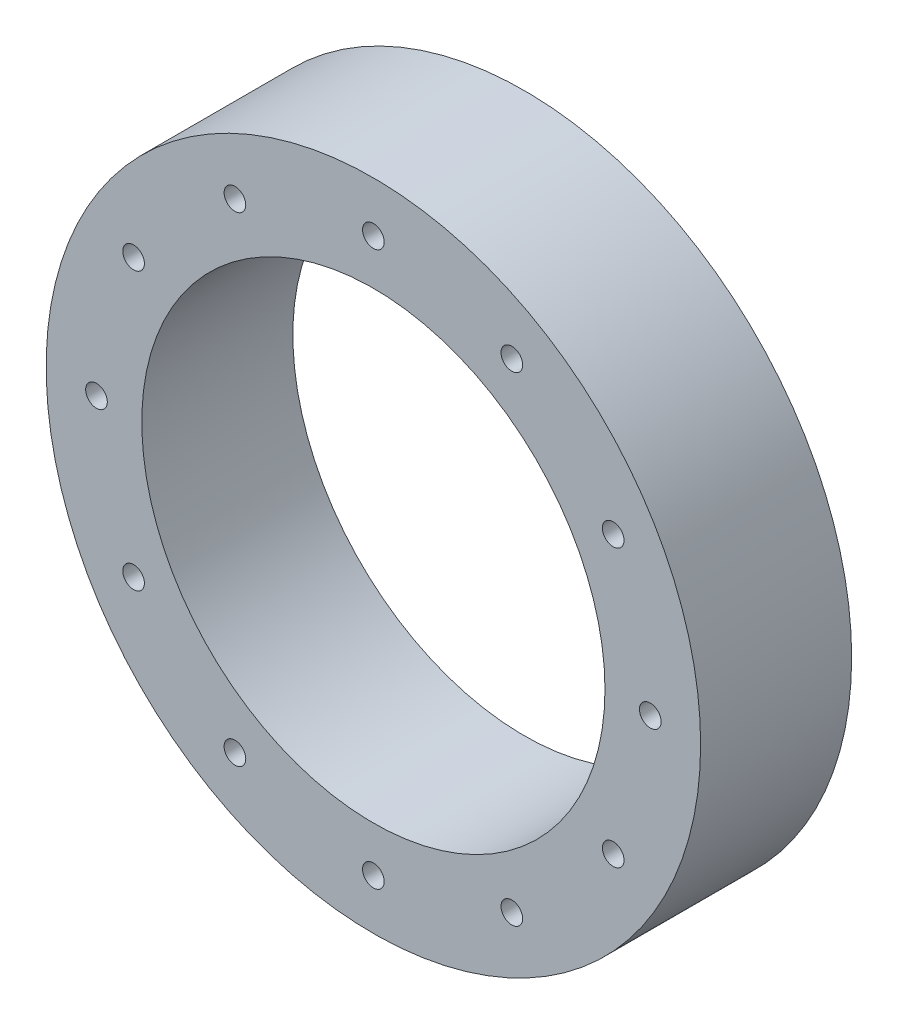
ISO-10303-21;
HEADER;
FILE_DESCRIPTION(('STEP AP214'),'2;1');
FILE_NAME('part.step','',(''),(''),'','','');
FILE_SCHEMA(('AUTOMOTIVE_DESIGN { 1 0 10303 214 1 1 1 1 }'));
ENDSEC;
DATA;
#1=APPLICATION_CONTEXT('core data for automotive mechanical design processes');
#2=APPLICATION_PROTOCOL_DEFINITION('international standard','automotive_design',2000,#1);
#3=PRODUCT_CONTEXT('',#1,'mechanical');
#4=PRODUCT('Part','Part','',(#3));
#5=PRODUCT_RELATED_PRODUCT_CATEGORY('part','',(#4));
#6=PRODUCT_DEFINITION_FORMATION('','',#4);
#7=PRODUCT_DEFINITION_CONTEXT('part definition',#1,'design');
#8=PRODUCT_DEFINITION('design','',#6,#7);
#9=PRODUCT_DEFINITION_SHAPE('','',#8);
#10=(LENGTH_UNIT() NAMED_UNIT(*) SI_UNIT(.MILLI.,.METRE.));
#11=(NAMED_UNIT(*) PLANE_ANGLE_UNIT() SI_UNIT($,.RADIAN.));
#12=(NAMED_UNIT(*) SI_UNIT($,.STERADIAN.) SOLID_ANGLE_UNIT());
#13=UNCERTAINTY_MEASURE_WITH_UNIT(LENGTH_MEASURE(1.E-05),#10,'distance_accuracy_value','');
#14=(GEOMETRIC_REPRESENTATION_CONTEXT(3) GLOBAL_UNCERTAINTY_ASSIGNED_CONTEXT((#13)) GLOBAL_UNIT_ASSIGNED_CONTEXT((#10,
#11,#12)) REPRESENTATION_CONTEXT('',''));
#15=CARTESIAN_POINT('',(0.,0.,0.));
#16=DIRECTION('',(0.,0.,1.));
#17=DIRECTION('',(1.,0.,0.));
#18=AXIS2_PLACEMENT_3D('',#15,#16,#17);
#19=CARTESIAN_POINT('',(0.,0.,30.));
#20=DIRECTION('',(0.,0.,1.));
#21=DIRECTION('',(1.,0.,0.));
#22=AXIS2_PLACEMENT_3D('',#19,#20,#21);
#23=PLANE('',#22);
#24=CARTESIAN_POINT('',(-47.631397208143,27.4999999999979,30.));
#25=DIRECTION('',(0.,0.,1.));
#26=DIRECTION('',(1.,0.,0.));
#27=AXIS2_PLACEMENT_3D('',#24,#25,#26);
#28=CIRCLE('',#27,2.15);
#29=CARTESIAN_POINT('',(-45.481397208143,27.4999999999979,30.));
#30=VERTEX_POINT('',#29);
#31=EDGE_CURVE('E108',#30,#30,#28,.T.);
#32=ORIENTED_EDGE('',*,*,#31,.F.);
#33=EDGE_LOOP('',(#32));
#34=FACE_BOUND('',#33,.T.);
#35=CARTESIAN_POINT('',(-47.6313972081406,-27.500000000002,30.));
#36=DIRECTION('',(0.,0.,1.));
#37=DIRECTION('',(1.,0.,0.));
#38=AXIS2_PLACEMENT_3D('',#35,#36,#37);
#39=CIRCLE('',#38,2.15);
#40=CARTESIAN_POINT('',(-45.4813972081406,-27.500000000002,30.));
#41=VERTEX_POINT('',#40);
#42=EDGE_CURVE('E96',#41,#41,#39,.T.);
#43=ORIENTED_EDGE('',*,*,#42,.F.);
#44=EDGE_LOOP('',(#43));
#45=FACE_BOUND('',#44,.T.);
#46=CARTESIAN_POINT('',(4.66937538383073E-12,-55.,30.));
#47=DIRECTION('',(0.,0.,1.));
#48=DIRECTION('',(1.,0.,0.));
#49=AXIS2_PLACEMENT_3D('',#46,#47,#48);
#50=CIRCLE('',#49,2.15);
#51=CARTESIAN_POINT('',(2.15000000000467,-55.,30.));
#52=VERTEX_POINT('',#51);
#53=EDGE_CURVE('E84',#52,#52,#50,.T.);
#54=ORIENTED_EDGE('',*,*,#53,.F.);
#55=EDGE_LOOP('',(#54));
#56=FACE_BOUND('',#55,.T.);
#57=CARTESIAN_POINT('',(47.6313972081476,-27.499999999998,30.));
#58=DIRECTION('',(0.,0.,1.));
#59=DIRECTION('',(1.,0.,0.));
#60=AXIS2_PLACEMENT_3D('',#57,#58,#59);
#61=CIRCLE('',#60,2.15);
#62=CARTESIAN_POINT('',(49.7813972081476,-27.499999999998,30.));
#63=VERTEX_POINT('',#62);
#64=EDGE_CURVE('E72',#63,#63,#61,.T.);
#65=ORIENTED_EDGE('',*,*,#64,.F.);
#66=EDGE_LOOP('',(#65));
#67=FACE_BOUND('',#66,.T.);
#68=CARTESIAN_POINT('',(47.6313972081453,27.500000000002,30.));
#69=DIRECTION('',(0.,0.,1.));
#70=DIRECTION('',(1.,0.,0.));
#71=AXIS2_PLACEMENT_3D('',#68,#69,#70);
#72=CIRCLE('',#71,2.15);
#73=CARTESIAN_POINT('',(49.7813972081453,27.500000000002,30.));
#74=VERTEX_POINT('',#73);
#75=EDGE_CURVE('E60',#74,#74,#72,.T.);
#76=ORIENTED_EDGE('',*,*,#75,.F.);
#77=EDGE_LOOP('',(#76));
#78=FACE_BOUND('',#77,.T.);
#79=CARTESIAN_POINT('',(0.,55.,30.));
#80=DIRECTION('',(0.,0.,1.));
#81=DIRECTION('',(1.,0.,0.));
#82=AXIS2_PLACEMENT_3D('',#79,#80,#81);
#83=CIRCLE('',#82,2.15);
#84=CARTESIAN_POINT('',(2.15,55.,30.));
#85=VERTEX_POINT('',#84);
#86=EDGE_CURVE('E48',#85,#85,#83,.T.);
#87=ORIENTED_EDGE('',*,*,#86,.F.);
#88=EDGE_LOOP('',(#87));
#89=FACE_BOUND('',#88,.T.);
#90=CARTESIAN_POINT('',(0.,0.,30.));
#91=DIRECTION('',(0.,0.,1.));
#92=DIRECTION('',(1.,0.,0.));
#93=AXIS2_PLACEMENT_3D('',#90,#91,#92);
#94=CIRCLE('',#93,65.);
#95=CARTESIAN_POINT('',(65.,0.,30.));
#96=VERTEX_POINT('',#95);
#97=EDGE_CURVE('E10',#96,#96,#94,.T.);
#98=ORIENTED_EDGE('',*,*,#97,.T.);
#99=EDGE_LOOP('',(#98));
#100=FACE_BOUND('',#99,.T.);
#101=CARTESIAN_POINT('',(0.,0.,30.));
#102=DIRECTION('',(0.,0.,1.));
#103=DIRECTION('',(1.,0.,0.));
#104=AXIS2_PLACEMENT_3D('',#101,#102,#103);
#105=CIRCLE('',#104,46.);
#106=CARTESIAN_POINT('',(46.,0.,30.));
#107=VERTEX_POINT('',#106);
#108=EDGE_CURVE('E43',#107,#107,#105,.T.);
#109=ORIENTED_EDGE('',*,*,#108,.F.);
#110=EDGE_LOOP('',(#109));
#111=FACE_BOUND('',#110,.T.);
#112=CARTESIAN_POINT('',(27.5000000000001,47.6313972081441,30.));
#113=DIRECTION('',(0.,0.,1.));
#114=DIRECTION('',(1.,0.,0.));
#115=AXIS2_PLACEMENT_3D('',#112,#113,#114);
#116=CIRCLE('',#115,2.15);
#117=CARTESIAN_POINT('',(29.6500000000001,47.6313972081441,30.));
#118=VERTEX_POINT('',#117);
#119=EDGE_CURVE('E54',#118,#118,#116,.T.);
#120=ORIENTED_EDGE('',*,*,#119,.F.);
#121=EDGE_LOOP('',(#120));
#122=FACE_BOUND('',#121,.T.);
#123=CARTESIAN_POINT('',(55.0000000000023,2.33468769191537E-12,30.));
#124=DIRECTION('',(0.,0.,1.));
#125=DIRECTION('',(1.,0.,0.));
#126=AXIS2_PLACEMENT_3D('',#123,#124,#125);
#127=CIRCLE('',#126,2.15);
#128=CARTESIAN_POINT('',(57.1500000000023,2.33468769191537E-12,30.));
#129=VERTEX_POINT('',#128);
#130=EDGE_CURVE('E66',#129,#129,#127,.T.);
#131=ORIENTED_EDGE('',*,*,#130,.F.);
#132=EDGE_LOOP('',(#131));
#133=FACE_BOUND('',#132,.T.);
#134=CARTESIAN_POINT('',(27.5000000000044,-47.6313972081429,30.));
#135=DIRECTION('',(0.,0.,1.));
#136=DIRECTION('',(1.,0.,0.));
#137=AXIS2_PLACEMENT_3D('',#134,#135,#136);
#138=CIRCLE('',#137,2.15);
#139=CARTESIAN_POINT('',(29.6500000000044,-47.6313972081429,30.));
#140=VERTEX_POINT('',#139);
#141=EDGE_CURVE('E78',#140,#140,#138,.T.);
#142=ORIENTED_EDGE('',*,*,#141,.F.);
#143=EDGE_LOOP('',(#142));
#144=FACE_BOUND('',#143,.T.);
#145=CARTESIAN_POINT('',(-27.4999999999956,-47.6313972081453,30.));
#146=DIRECTION('',(0.,0.,1.));
#147=DIRECTION('',(1.,0.,0.));
#148=AXIS2_PLACEMENT_3D('',#145,#146,#147);
#149=CIRCLE('',#148,2.15);
#150=CARTESIAN_POINT('',(-25.3499999999956,-47.6313972081453,30.));
#151=VERTEX_POINT('',#150);
#152=EDGE_CURVE('E90',#151,#151,#149,.T.);
#153=ORIENTED_EDGE('',*,*,#152,.F.);
#154=EDGE_LOOP('',(#153));
#155=FACE_BOUND('',#154,.T.);
#156=CARTESIAN_POINT('',(-54.9999999999977,-2.34142324931068E-12,30.));
#157=DIRECTION('',(0.,0.,1.));
#158=DIRECTION('',(1.,0.,0.));
#159=AXIS2_PLACEMENT_3D('',#156,#157,#158);
#160=CIRCLE('',#159,2.15);
#161=CARTESIAN_POINT('',(-52.8499999999977,-2.34142324931068E-12,30.));
#162=VERTEX_POINT('',#161);
#163=EDGE_CURVE('E102',#162,#162,#160,.T.);
#164=ORIENTED_EDGE('',*,*,#163,.F.);
#165=EDGE_LOOP('',(#164));
#166=FACE_BOUND('',#165,.T.);
#167=CARTESIAN_POINT('',(-27.4999999999997,47.6313972081429,30.));
#168=DIRECTION('',(0.,0.,1.));
#169=DIRECTION('',(1.,0.,0.));
#170=AXIS2_PLACEMENT_3D('',#167,#168,#169);
#171=CIRCLE('',#170,2.15);
#172=CARTESIAN_POINT('',(-25.3499999999997,47.6313972081429,30.));
#173=VERTEX_POINT('',#172);
#174=EDGE_CURVE('E114',#173,#173,#171,.T.);
#175=ORIENTED_EDGE('',*,*,#174,.F.);
#176=EDGE_LOOP('',(#175));
#177=FACE_BOUND('',#176,.T.);
#178=ADVANCED_FACE('F32',(#34,#45,#56,#67,#78,#89,#100,#111,#122,#133,#144,#155,#166,#177),#23,.T.);
#179=CARTESIAN_POINT('',(0.,0.,0.));
#180=DIRECTION('',(0.,0.,1.));
#181=DIRECTION('',(1.,0.,0.));
#182=AXIS2_PLACEMENT_3D('',#179,#180,#181);
#183=PLANE('',#182);
#184=CARTESIAN_POINT('',(0.,0.,0.));
#185=DIRECTION('',(0.,0.,1.));
#186=DIRECTION('',(1.,0.,0.));
#187=AXIS2_PLACEMENT_3D('',#184,#185,#186);
#188=CIRCLE('',#187,65.);
#189=CARTESIAN_POINT('',(65.,0.,0.));
#190=VERTEX_POINT('',#189);
#191=EDGE_CURVE('E36',#190,#190,#188,.T.);
#192=ORIENTED_EDGE('',*,*,#191,.F.);
#193=EDGE_LOOP('',(#192));
#194=FACE_BOUND('',#193,.T.);
#195=CARTESIAN_POINT('',(0.,0.,0.));
#196=DIRECTION('',(0.,0.,1.));
#197=DIRECTION('',(1.,0.,0.));
#198=AXIS2_PLACEMENT_3D('',#195,#196,#197);
#199=CIRCLE('',#198,46.);
#200=CARTESIAN_POINT('',(46.,0.,0.));
#201=VERTEX_POINT('',#200);
#202=EDGE_CURVE('E45',#201,#201,#199,.T.);
#203=ORIENTED_EDGE('',*,*,#202,.T.);
#204=EDGE_LOOP('',(#203));
#205=FACE_BOUND('',#204,.T.);
#206=CARTESIAN_POINT('',(0.,55.,0.));
#207=DIRECTION('',(0.,0.,1.));
#208=DIRECTION('',(1.,0.,0.));
#209=AXIS2_PLACEMENT_3D('',#206,#207,#208);
#210=CIRCLE('',#209,2.15);
#211=CARTESIAN_POINT('',(2.15,55.,0.));
#212=VERTEX_POINT('',#211);
#213=EDGE_CURVE('E51',#212,#212,#210,.T.);
#214=ORIENTED_EDGE('',*,*,#213,.T.);
#215=EDGE_LOOP('',(#214));
#216=FACE_BOUND('',#215,.T.);
#217=CARTESIAN_POINT('',(27.5000000000001,47.6313972081441,0.));
#218=DIRECTION('',(0.,0.,1.));
#219=DIRECTION('',(1.,0.,0.));
#220=AXIS2_PLACEMENT_3D('',#217,#218,#219);
#221=CIRCLE('',#220,2.15);
#222=CARTESIAN_POINT('',(29.6500000000001,47.6313972081441,0.));
#223=VERTEX_POINT('',#222);
#224=EDGE_CURVE('E57',#223,#223,#221,.T.);
#225=ORIENTED_EDGE('',*,*,#224,.T.);
#226=EDGE_LOOP('',(#225));
#227=FACE_BOUND('',#226,.T.);
#228=CARTESIAN_POINT('',(47.6313972081453,27.500000000002,0.));
#229=DIRECTION('',(0.,0.,1.));
#230=DIRECTION('',(1.,0.,0.));
#231=AXIS2_PLACEMENT_3D('',#228,#229,#230);
#232=CIRCLE('',#231,2.15);
#233=CARTESIAN_POINT('',(49.7813972081453,27.500000000002,0.));
#234=VERTEX_POINT('',#233);
#235=EDGE_CURVE('E63',#234,#234,#232,.T.);
#236=ORIENTED_EDGE('',*,*,#235,.T.);
#237=EDGE_LOOP('',(#236));
#238=FACE_BOUND('',#237,.T.);
#239=CARTESIAN_POINT('',(55.0000000000023,2.33468769191537E-12,0.));
#240=DIRECTION('',(0.,0.,1.));
#241=DIRECTION('',(1.,0.,0.));
#242=AXIS2_PLACEMENT_3D('',#239,#240,#241);
#243=CIRCLE('',#242,2.15);
#244=CARTESIAN_POINT('',(57.1500000000023,2.33468769191537E-12,0.));
#245=VERTEX_POINT('',#244);
#246=EDGE_CURVE('E69',#245,#245,#243,.T.);
#247=ORIENTED_EDGE('',*,*,#246,.T.);
#248=EDGE_LOOP('',(#247));
#249=FACE_BOUND('',#248,.T.);
#250=CARTESIAN_POINT('',(47.6313972081476,-27.499999999998,0.));
#251=DIRECTION('',(0.,0.,1.));
#252=DIRECTION('',(1.,0.,0.));
#253=AXIS2_PLACEMENT_3D('',#250,#251,#252);
#254=CIRCLE('',#253,2.15);
#255=CARTESIAN_POINT('',(49.7813972081476,-27.499999999998,0.));
#256=VERTEX_POINT('',#255);
#257=EDGE_CURVE('E75',#256,#256,#254,.T.);
#258=ORIENTED_EDGE('',*,*,#257,.T.);
#259=EDGE_LOOP('',(#258));
#260=FACE_BOUND('',#259,.T.);
#261=CARTESIAN_POINT('',(27.5000000000044,-47.6313972081429,0.));
#262=DIRECTION('',(0.,0.,1.));
#263=DIRECTION('',(1.,0.,0.));
#264=AXIS2_PLACEMENT_3D('',#261,#262,#263);
#265=CIRCLE('',#264,2.15);
#266=CARTESIAN_POINT('',(29.6500000000044,-47.6313972081429,0.));
#267=VERTEX_POINT('',#266);
#268=EDGE_CURVE('E81',#267,#267,#265,.T.);
#269=ORIENTED_EDGE('',*,*,#268,.T.);
#270=EDGE_LOOP('',(#269));
#271=FACE_BOUND('',#270,.T.);
#272=CARTESIAN_POINT('',(4.66937538383073E-12,-55.,0.));
#273=DIRECTION('',(0.,0.,1.));
#274=DIRECTION('',(1.,0.,0.));
#275=AXIS2_PLACEMENT_3D('',#272,#273,#274);
#276=CIRCLE('',#275,2.15);
#277=CARTESIAN_POINT('',(2.15000000000467,-55.,0.));
#278=VERTEX_POINT('',#277);
#279=EDGE_CURVE('E87',#278,#278,#276,.T.);
#280=ORIENTED_EDGE('',*,*,#279,.T.);
#281=EDGE_LOOP('',(#280));
#282=FACE_BOUND('',#281,.T.);
#283=CARTESIAN_POINT('',(-27.4999999999956,-47.6313972081453,0.));
#284=DIRECTION('',(0.,0.,1.));
#285=DIRECTION('',(1.,0.,0.));
#286=AXIS2_PLACEMENT_3D('',#283,#284,#285);
#287=CIRCLE('',#286,2.15);
#288=CARTESIAN_POINT('',(-25.3499999999956,-47.6313972081453,0.));
#289=VERTEX_POINT('',#288);
#290=EDGE_CURVE('E93',#289,#289,#287,.T.);
#291=ORIENTED_EDGE('',*,*,#290,.T.);
#292=EDGE_LOOP('',(#291));
#293=FACE_BOUND('',#292,.T.);
#294=CARTESIAN_POINT('',(-47.6313972081406,-27.500000000002,0.));
#295=DIRECTION('',(0.,0.,1.));
#296=DIRECTION('',(1.,0.,0.));
#297=AXIS2_PLACEMENT_3D('',#294,#295,#296);
#298=CIRCLE('',#297,2.15);
#299=CARTESIAN_POINT('',(-45.4813972081406,-27.500000000002,0.));
#300=VERTEX_POINT('',#299);
#301=EDGE_CURVE('E99',#300,#300,#298,.T.);
#302=ORIENTED_EDGE('',*,*,#301,.T.);
#303=EDGE_LOOP('',(#302));
#304=FACE_BOUND('',#303,.T.);
#305=CARTESIAN_POINT('',(-54.9999999999977,-2.34142324931068E-12,0.));
#306=DIRECTION('',(0.,0.,1.));
#307=DIRECTION('',(1.,0.,0.));
#308=AXIS2_PLACEMENT_3D('',#305,#306,#307);
#309=CIRCLE('',#308,2.15);
#310=CARTESIAN_POINT('',(-52.8499999999977,-2.34142324931068E-12,0.));
#311=VERTEX_POINT('',#310);
#312=EDGE_CURVE('E105',#311,#311,#309,.T.);
#313=ORIENTED_EDGE('',*,*,#312,.T.);
#314=EDGE_LOOP('',(#313));
#315=FACE_BOUND('',#314,.T.);
#316=CARTESIAN_POINT('',(-47.631397208143,27.4999999999979,0.));
#317=DIRECTION('',(0.,0.,1.));
#318=DIRECTION('',(1.,0.,0.));
#319=AXIS2_PLACEMENT_3D('',#316,#317,#318);
#320=CIRCLE('',#319,2.15);
#321=CARTESIAN_POINT('',(-45.481397208143,27.4999999999979,0.));
#322=VERTEX_POINT('',#321);
#323=EDGE_CURVE('E111',#322,#322,#320,.T.);
#324=ORIENTED_EDGE('',*,*,#323,.T.);
#325=EDGE_LOOP('',(#324));
#326=FACE_BOUND('',#325,.T.);
#327=CARTESIAN_POINT('',(-27.4999999999997,47.6313972081429,0.));
#328=DIRECTION('',(0.,0.,1.));
#329=DIRECTION('',(1.,0.,0.));
#330=AXIS2_PLACEMENT_3D('',#327,#328,#329);
#331=CIRCLE('',#330,2.15);
#332=CARTESIAN_POINT('',(-25.3499999999997,47.6313972081429,0.));
#333=VERTEX_POINT('',#332);
#334=EDGE_CURVE('E117',#333,#333,#331,.T.);
#335=ORIENTED_EDGE('',*,*,#334,.T.);
#336=EDGE_LOOP('',(#335));
#337=FACE_BOUND('',#336,.T.);
#338=ADVANCED_FACE('F127',(#194,#205,#216,#227,#238,#249,#260,#271,#282,#293,#304,#315,#326,
#337),#183,.F.);
#339=CARTESIAN_POINT('',(0.,0.,30.));
#340=DIRECTION('',(0.,0.,-1.));
#341=DIRECTION('',(-1.,0.,0.));
#342=AXIS2_PLACEMENT_3D('',#339,#340,#341);
#343=CYLINDRICAL_SURFACE('',#342,65.);
#344=ORIENTED_EDGE('',*,*,#97,.F.);
#345=EDGE_LOOP('',(#344));
#346=FACE_BOUND('',#345,.T.);
#347=ORIENTED_EDGE('',*,*,#191,.T.);
#348=EDGE_LOOP('',(#347));
#349=FACE_BOUND('',#348,.T.);
#350=ADVANCED_FACE('F34',(#346,#349),#343,.T.);
#351=CARTESIAN_POINT('',(0.,0.,30.));
#352=DIRECTION('',(0.,0.,-1.));
#353=DIRECTION('',(-1.,0.,0.));
#354=AXIS2_PLACEMENT_3D('',#351,#352,#353);
#355=CYLINDRICAL_SURFACE('',#354,46.);
#356=ORIENTED_EDGE('',*,*,#108,.T.);
#357=EDGE_LOOP('',(#356));
#358=FACE_BOUND('',#357,.T.);
#359=ORIENTED_EDGE('',*,*,#202,.F.);
#360=EDGE_LOOP('',(#359));
#361=FACE_BOUND('',#360,.T.);
#362=ADVANCED_FACE('F137',(#358,#361),#355,.F.);
#363=CARTESIAN_POINT('',(0.,55.,30.));
#364=DIRECTION('',(0.,0.,-1.));
#365=DIRECTION('',(-1.,0.,0.));
#366=AXIS2_PLACEMENT_3D('',#363,#364,#365);
#367=CYLINDRICAL_SURFACE('',#366,2.15);
#368=ORIENTED_EDGE('',*,*,#86,.T.);
#369=EDGE_LOOP('',(#368));
#370=FACE_BOUND('',#369,.T.);
#371=ORIENTED_EDGE('',*,*,#213,.F.);
#372=EDGE_LOOP('',(#371));
#373=FACE_BOUND('',#372,.T.);
#374=ADVANCED_FACE('F140',(#370,#373),#367,.F.);
#375=CARTESIAN_POINT('',(27.5000000000001,47.6313972081441,30.));
#376=DIRECTION('',(0.,0.,-1.));
#377=DIRECTION('',(-1.,0.,0.));
#378=AXIS2_PLACEMENT_3D('',#375,#376,#377);
#379=CYLINDRICAL_SURFACE('',#378,2.15);
#380=ORIENTED_EDGE('',*,*,#119,.T.);
#381=EDGE_LOOP('',(#380));
#382=FACE_BOUND('',#381,.T.);
#383=ORIENTED_EDGE('',*,*,#224,.F.);
#384=EDGE_LOOP('',(#383));
#385=FACE_BOUND('',#384,.T.);
#386=ADVANCED_FACE('F144',(#382,#385),#379,.F.);
#387=CARTESIAN_POINT('',(47.6313972081453,27.500000000002,30.));
#388=DIRECTION('',(0.,0.,-1.));
#389=DIRECTION('',(-1.,0.,0.));
#390=AXIS2_PLACEMENT_3D('',#387,#388,#389);
#391=CYLINDRICAL_SURFACE('',#390,2.15);
#392=ORIENTED_EDGE('',*,*,#75,.T.);
#393=EDGE_LOOP('',(#392));
#394=FACE_BOUND('',#393,.T.);
#395=ORIENTED_EDGE('',*,*,#235,.F.);
#396=EDGE_LOOP('',(#395));
#397=FACE_BOUND('',#396,.T.);
#398=ADVANCED_FACE('F148',(#394,#397),#391,.F.);
#399=CARTESIAN_POINT('',(55.0000000000023,2.33468769191537E-12,30.));
#400=DIRECTION('',(0.,0.,-1.));
#401=DIRECTION('',(-1.,0.,0.));
#402=AXIS2_PLACEMENT_3D('',#399,#400,#401);
#403=CYLINDRICAL_SURFACE('',#402,2.15);
#404=ORIENTED_EDGE('',*,*,#130,.T.);
#405=EDGE_LOOP('',(#404));
#406=FACE_BOUND('',#405,.T.);
#407=ORIENTED_EDGE('',*,*,#246,.F.);
#408=EDGE_LOOP('',(#407));
#409=FACE_BOUND('',#408,.T.);
#410=ADVANCED_FACE('F152',(#406,#409),#403,.F.);
#411=CARTESIAN_POINT('',(47.6313972081476,-27.499999999998,30.));
#412=DIRECTION('',(0.,0.,-1.));
#413=DIRECTION('',(-1.,0.,0.));
#414=AXIS2_PLACEMENT_3D('',#411,#412,#413);
#415=CYLINDRICAL_SURFACE('',#414,2.15);
#416=ORIENTED_EDGE('',*,*,#64,.T.);
#417=EDGE_LOOP('',(#416));
#418=FACE_BOUND('',#417,.T.);
#419=ORIENTED_EDGE('',*,*,#257,.F.);
#420=EDGE_LOOP('',(#419));
#421=FACE_BOUND('',#420,.T.);
#422=ADVANCED_FACE('F156',(#418,#421),#415,.F.);
#423=CARTESIAN_POINT('',(27.5000000000044,-47.6313972081429,30.));
#424=DIRECTION('',(0.,0.,-1.));
#425=DIRECTION('',(-1.,0.,0.));
#426=AXIS2_PLACEMENT_3D('',#423,#424,#425);
#427=CYLINDRICAL_SURFACE('',#426,2.15);
#428=ORIENTED_EDGE('',*,*,#141,.T.);
#429=EDGE_LOOP('',(#428));
#430=FACE_BOUND('',#429,.T.);
#431=ORIENTED_EDGE('',*,*,#268,.F.);
#432=EDGE_LOOP('',(#431));
#433=FACE_BOUND('',#432,.T.);
#434=ADVANCED_FACE('F160',(#430,#433),#427,.F.);
#435=CARTESIAN_POINT('',(4.66937538383073E-12,-55.,30.));
#436=DIRECTION('',(0.,0.,-1.));
#437=DIRECTION('',(-1.,0.,0.));
#438=AXIS2_PLACEMENT_3D('',#435,#436,#437);
#439=CYLINDRICAL_SURFACE('',#438,2.15);
#440=ORIENTED_EDGE('',*,*,#53,.T.);
#441=EDGE_LOOP('',(#440));
#442=FACE_BOUND('',#441,.T.);
#443=ORIENTED_EDGE('',*,*,#279,.F.);
#444=EDGE_LOOP('',(#443));
#445=FACE_BOUND('',#444,.T.);
#446=ADVANCED_FACE('F164',(#442,#445),#439,.F.);
#447=CARTESIAN_POINT('',(-27.4999999999956,-47.6313972081453,30.));
#448=DIRECTION('',(0.,0.,-1.));
#449=DIRECTION('',(-1.,0.,0.));
#450=AXIS2_PLACEMENT_3D('',#447,#448,#449);
#451=CYLINDRICAL_SURFACE('',#450,2.15);
#452=ORIENTED_EDGE('',*,*,#152,.T.);
#453=EDGE_LOOP('',(#452));
#454=FACE_BOUND('',#453,.T.);
#455=ORIENTED_EDGE('',*,*,#290,.F.);
#456=EDGE_LOOP('',(#455));
#457=FACE_BOUND('',#456,.T.);
#458=ADVANCED_FACE('F168',(#454,#457),#451,.F.);
#459=CARTESIAN_POINT('',(-47.6313972081406,-27.500000000002,30.));
#460=DIRECTION('',(0.,0.,-1.));
#461=DIRECTION('',(-1.,0.,0.));
#462=AXIS2_PLACEMENT_3D('',#459,#460,#461);
#463=CYLINDRICAL_SURFACE('',#462,2.15);
#464=ORIENTED_EDGE('',*,*,#42,.T.);
#465=EDGE_LOOP('',(#464));
#466=FACE_BOUND('',#465,.T.);
#467=ORIENTED_EDGE('',*,*,#301,.F.);
#468=EDGE_LOOP('',(#467));
#469=FACE_BOUND('',#468,.T.);
#470=ADVANCED_FACE('F172',(#466,#469),#463,.F.);
#471=CARTESIAN_POINT('',(-54.9999999999977,-2.34142324931068E-12,30.));
#472=DIRECTION('',(0.,0.,-1.));
#473=DIRECTION('',(-1.,0.,0.));
#474=AXIS2_PLACEMENT_3D('',#471,#472,#473);
#475=CYLINDRICAL_SURFACE('',#474,2.15);
#476=ORIENTED_EDGE('',*,*,#163,.T.);
#477=EDGE_LOOP('',(#476));
#478=FACE_BOUND('',#477,.T.);
#479=ORIENTED_EDGE('',*,*,#312,.F.);
#480=EDGE_LOOP('',(#479));
#481=FACE_BOUND('',#480,.T.);
#482=ADVANCED_FACE('F176',(#478,#481),#475,.F.);
#483=CARTESIAN_POINT('',(-47.631397208143,27.4999999999979,30.));
#484=DIRECTION('',(0.,0.,-1.));
#485=DIRECTION('',(-1.,0.,0.));
#486=AXIS2_PLACEMENT_3D('',#483,#484,#485);
#487=CYLINDRICAL_SURFACE('',#486,2.15);
#488=ORIENTED_EDGE('',*,*,#31,.T.);
#489=EDGE_LOOP('',(#488));
#490=FACE_BOUND('',#489,.T.);
#491=ORIENTED_EDGE('',*,*,#323,.F.);
#492=EDGE_LOOP('',(#491));
#493=FACE_BOUND('',#492,.T.);
#494=ADVANCED_FACE('F180',(#490,#493),#487,.F.);
#495=CARTESIAN_POINT('',(-27.4999999999997,47.6313972081429,30.));
#496=DIRECTION('',(0.,0.,-1.));
#497=DIRECTION('',(-1.,0.,0.));
#498=AXIS2_PLACEMENT_3D('',#495,#496,#497);
#499=CYLINDRICAL_SURFACE('',#498,2.15);
#500=ORIENTED_EDGE('',*,*,#174,.T.);
#501=EDGE_LOOP('',(#500));
#502=FACE_BOUND('',#501,.T.);
#503=ORIENTED_EDGE('',*,*,#334,.F.);
#504=EDGE_LOOP('',(#503));
#505=FACE_BOUND('',#504,.T.);
#506=ADVANCED_FACE('F123',(#502,#505),#499,.F.);
#507=CLOSED_SHELL('',(#178,#338,#350,#362,#374,#386,#398,#410,#422,#434,#446,#458,#470,#482,
#494,#506));
#508=MANIFOLD_SOLID_BREP('B2',#507);
#509=ADVANCED_BREP_SHAPE_REPRESENTATION('',(#18,#508),#14);
#510=SHAPE_DEFINITION_REPRESENTATION(#9,#509);
ENDSEC;
END-ISO-10303-21;
